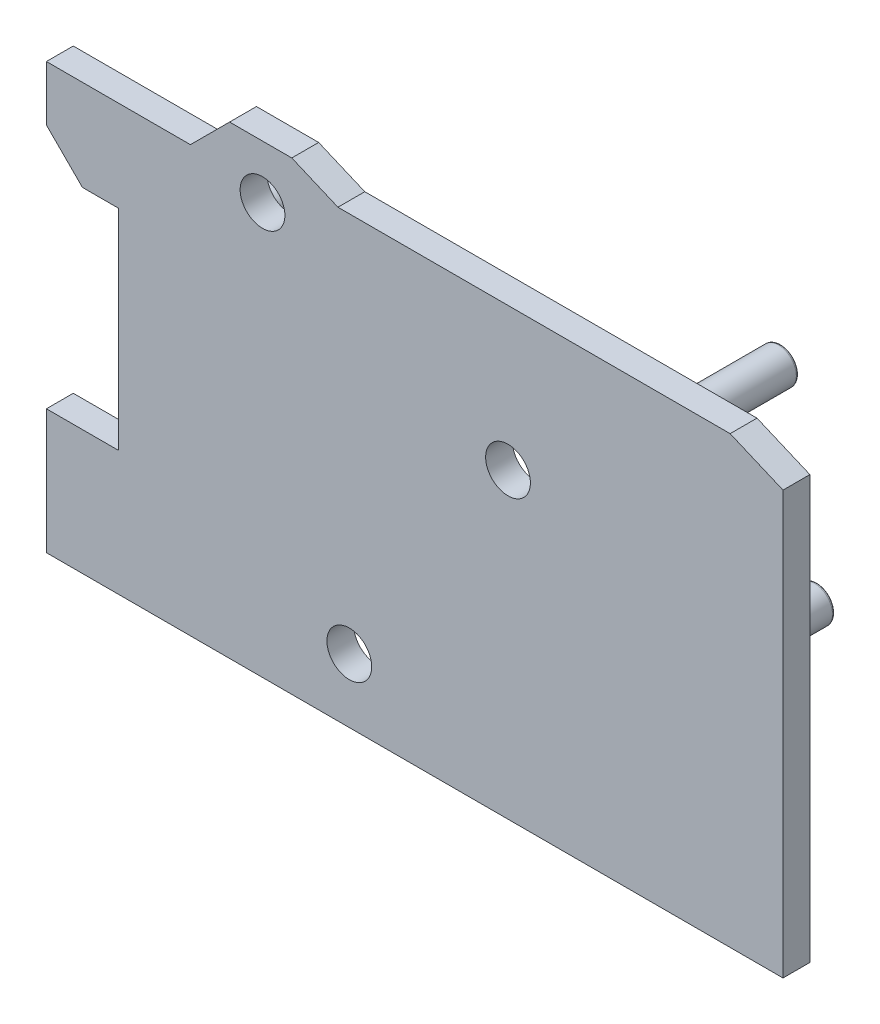
ISO-10303-21;
HEADER;
FILE_DESCRIPTION(('STEP AP214'),'2;1');
FILE_NAME('part.step','',(''),(''),'','','');
FILE_SCHEMA(('AUTOMOTIVE_DESIGN { 1 0 10303 214 1 1 1 1 }'));
ENDSEC;
DATA;
#1=APPLICATION_CONTEXT('core data for automotive mechanical design processes');
#2=APPLICATION_PROTOCOL_DEFINITION('international standard','automotive_design',2000,#1);
#3=PRODUCT_CONTEXT('',#1,'mechanical');
#4=PRODUCT('Part','Part','',(#3));
#5=PRODUCT_RELATED_PRODUCT_CATEGORY('part','',(#4));
#6=PRODUCT_DEFINITION_FORMATION('','',#4);
#7=PRODUCT_DEFINITION_CONTEXT('part definition',#1,'design');
#8=PRODUCT_DEFINITION('design','',#6,#7);
#9=PRODUCT_DEFINITION_SHAPE('','',#8);
#10=(LENGTH_UNIT() NAMED_UNIT(*) SI_UNIT(.MILLI.,.METRE.));
#11=(NAMED_UNIT(*) PLANE_ANGLE_UNIT() SI_UNIT($,.RADIAN.));
#12=(NAMED_UNIT(*) SI_UNIT($,.STERADIAN.) SOLID_ANGLE_UNIT());
#13=UNCERTAINTY_MEASURE_WITH_UNIT(LENGTH_MEASURE(1.E-05),#10,'distance_accuracy_value','');
#14=(GEOMETRIC_REPRESENTATION_CONTEXT(3) GLOBAL_UNCERTAINTY_ASSIGNED_CONTEXT((#13)) GLOBAL_UNIT_ASSIGNED_CONTEXT((#10,
#11,#12)) REPRESENTATION_CONTEXT('',''));
#15=CARTESIAN_POINT('',(0.,0.,0.));
#16=DIRECTION('',(0.,0.,1.));
#17=DIRECTION('',(1.,0.,0.));
#18=AXIS2_PLACEMENT_3D('',#15,#16,#17);
#19=CARTESIAN_POINT('',(0.,0.,0.));
#20=DIRECTION('',(0.,0.,1.));
#21=DIRECTION('',(1.,0.,0.));
#22=AXIS2_PLACEMENT_3D('',#19,#20,#21);
#23=PLANE('',#22);
#24=DIRECTION('',(0.,1.,0.));
#25=VECTOR('',#24,1.);
#26=CARTESIAN_POINT('',(-41.9859879824044,0.,0.));
#27=LINE('',#26,#25);
#28=CARTESIAN_POINT('',(-41.9859879824044,15.3226512655119,0.));
#29=VERTEX_POINT('',#28);
#30=CARTESIAN_POINT('',(-41.9859879824044,21.4676722339106,0.));
#31=VERTEX_POINT('',#30);
#32=EDGE_CURVE('E190',#29,#31,#27,.T.);
#33=ORIENTED_EDGE('',*,*,#32,.T.);
#34=DIRECTION('',(1.,0.,0.));
#35=VECTOR('',#34,1.);
#36=CARTESIAN_POINT('',(0.,21.4676722339106,0.));
#37=LINE('',#36,#35);
#38=CARTESIAN_POINT('',(-25.9008330348861,21.4676722339106,0.));
#39=VERTEX_POINT('',#38);
#40=EDGE_CURVE('E225',#31,#39,#37,.T.);
#41=ORIENTED_EDGE('',*,*,#40,.T.);
#42=DIRECTION('',(0.707106781186546,0.707106781186549,0.));
#43=VECTOR('',#42,1.);
#44=CARTESIAN_POINT('',(-23.6842526343984,23.6842526343983,0.));
#45=LINE('',#44,#43);
#46=CARTESIAN_POINT('',(-21.5253547970426,25.8431504717542,0.));
#47=VERTEX_POINT('',#46);
#48=EDGE_CURVE('E223',#39,#47,#45,.T.);
#49=ORIENTED_EDGE('',*,*,#48,.T.);
#50=DIRECTION('',(1.,0.,0.));
#51=VECTOR('',#50,1.);
#52=CARTESIAN_POINT('',(0.,25.8431504717542,0.));
#53=LINE('',#52,#51);
#54=CARTESIAN_POINT('',(-14.5763985821401,25.8431504717542,0.));
#55=VERTEX_POINT('',#54);
#56=EDGE_CURVE('E156',#47,#55,#53,.T.);
#57=ORIENTED_EDGE('',*,*,#56,.T.);
#58=DIRECTION('',(0.920521197051277,-0.390692623144184,0.));
#59=VECTOR('',#58,1.);
#60=CARTESIAN_POINT('',(7.06930031443443,16.656164980511,0.));
#61=LINE('',#60,#59);
#62=CARTESIAN_POINT('',(-9.42180872482766,23.6554113528324,0.));
#63=VERTEX_POINT('',#62);
#64=EDGE_CURVE('E219',#55,#63,#61,.T.);
#65=ORIENTED_EDGE('',*,*,#64,.T.);
#66=DIRECTION('',(1.,0.,0.));
#67=VECTOR('',#66,1.);
#68=CARTESIAN_POINT('',(0.,23.6554113528324,0.));
#69=LINE('',#68,#67);
#70=CARTESIAN_POINT('',(34.3842382576745,23.6554113528324,0.));
#71=VERTEX_POINT('',#70);
#72=EDGE_CURVE('E216',#63,#71,#69,.T.);
#73=ORIENTED_EDGE('',*,*,#72,.T.);
#74=DIRECTION('',(0.920521197051277,-0.390692623144184,0.));
#75=VECTOR('',#74,1.);
#76=CARTESIAN_POINT('',(13.7558871193649,32.4106085641319,0.));
#77=LINE('',#76,#75);
#78=CARTESIAN_POINT('',(40.2905887707238,21.1486058794287,0.));
#79=VERTEX_POINT('',#78);
#80=EDGE_CURVE('E213',#71,#79,#77,.T.);
#81=ORIENTED_EDGE('',*,*,#80,.T.);
#82=DIRECTION('',(0.,-1.,0.));
#83=VECTOR('',#82,1.);
#84=CARTESIAN_POINT('',(40.2905887707238,0.,0.));
#85=LINE('',#84,#83);
#86=CARTESIAN_POINT('',(40.2905887707238,-26.0480687490275,0.));
#87=VERTEX_POINT('',#86);
#88=EDGE_CURVE('E210',#79,#87,#85,.T.);
#89=ORIENTED_EDGE('',*,*,#88,.T.);
#90=DIRECTION('',(-1.,0.,0.));
#91=VECTOR('',#90,1.);
#92=CARTESIAN_POINT('',(0.,-26.0480687490275,0.));
#93=LINE('',#92,#91);
#94=CARTESIAN_POINT('',(-41.9859879824044,-26.0480687490275,0.));
#95=VERTEX_POINT('',#94);
#96=EDGE_CURVE('E207',#87,#95,#93,.T.);
#97=ORIENTED_EDGE('',*,*,#96,.T.);
#98=DIRECTION('',(0.,1.,0.));
#99=VECTOR('',#98,1.);
#100=CARTESIAN_POINT('',(-41.9859879824044,0.,0.));
#101=LINE('',#100,#99);
#102=CARTESIAN_POINT('',(-41.9859879824044,-12.1233586808849,0.));
#103=VERTEX_POINT('',#102);
#104=EDGE_CURVE('E204',#95,#103,#101,.T.);
#105=ORIENTED_EDGE('',*,*,#104,.T.);
#106=DIRECTION('',(1.,0.,0.));
#107=VECTOR('',#106,1.);
#108=CARTESIAN_POINT('',(0.,-12.1233586808849,0.));
#109=LINE('',#108,#107);
#110=CARTESIAN_POINT('',(-33.9434105086453,-12.1233586808849,0.));
#111=VERTEX_POINT('',#110);
#112=EDGE_CURVE('E201',#103,#111,#109,.T.);
#113=ORIENTED_EDGE('',*,*,#112,.T.);
#114=DIRECTION('',(0.,1.,0.));
#115=VECTOR('',#114,1.);
#116=CARTESIAN_POINT('',(-33.9434105086453,0.,0.));
#117=LINE('',#116,#115);
#118=CARTESIAN_POINT('',(-33.9434105086453,11.3013625286319,0.));
#119=VERTEX_POINT('',#118);
#120=EDGE_CURVE('E198',#111,#119,#117,.T.);
#121=ORIENTED_EDGE('',*,*,#120,.T.);
#122=DIRECTION('',(-1.,0.,0.));
#123=VECTOR('',#122,1.);
#124=CARTESIAN_POINT('',(0.,11.3013625286319,0.));
#125=LINE('',#124,#123);
#126=CARTESIAN_POINT('',(-37.9646992455244,11.3013625286319,0.));
#127=VERTEX_POINT('',#126);
#128=EDGE_CURVE('E195',#119,#127,#125,.T.);
#129=ORIENTED_EDGE('',*,*,#128,.T.);
#130=DIRECTION('',(-0.707106781186549,0.707106781186546,0.));
#131=VECTOR('',#130,1.);
#132=CARTESIAN_POINT('',(-13.3316683584461,-13.3316683584462,0.));
#133=LINE('',#132,#131);
#134=EDGE_CURVE('E192',#127,#29,#133,.T.);
#135=ORIENTED_EDGE('',*,*,#134,.T.);
#136=EDGE_LOOP('',(#33,#41,#49,#57,#65,#73,#81,#89,#97,#105,#113,#121,#129,#135));
#137=FACE_BOUND('',#136,.T.);
#138=CARTESIAN_POINT('',(-17.8476996058403,19.8975408613633,0.));
#139=DIRECTION('',(0.,0.,1.));
#140=DIRECTION('',(1.,0.,0.));
#141=AXIS2_PLACEMENT_3D('',#138,#139,#140);
#142=CIRCLE('',#141,2.5);
#143=CARTESIAN_POINT('',(-15.3476996058403,19.8975408613633,0.));
#144=VERTEX_POINT('',#143);
#145=EDGE_CURVE('E187',#144,#144,#142,.T.);
#146=ORIENTED_EDGE('',*,*,#145,.T.);
#147=EDGE_LOOP('',(#146));
#148=FACE_BOUND('',#147,.T.);
#149=CARTESIAN_POINT('',(-8.15375873902702,-18.910029411339,0.));
#150=DIRECTION('',(0.,0.,1.));
#151=DIRECTION('',(1.,0.,0.));
#152=AXIS2_PLACEMENT_3D('',#149,#150,#151);
#153=CIRCLE('',#152,2.5);
#154=CARTESIAN_POINT('',(-5.65375873902702,-18.910029411339,0.));
#155=VERTEX_POINT('',#154);
#156=EDGE_CURVE('E183',#155,#155,#153,.T.);
#157=ORIENTED_EDGE('',*,*,#156,.T.);
#158=EDGE_LOOP('',(#157));
#159=FACE_BOUND('',#158,.T.);
#160=CARTESIAN_POINT('',(9.57424648476948,7.73050044046848,0.));
#161=DIRECTION('',(0.,0.,1.));
#162=DIRECTION('',(1.,0.,0.));
#163=AXIS2_PLACEMENT_3D('',#160,#161,#162);
#164=CIRCLE('',#163,2.5);
#165=CARTESIAN_POINT('',(12.0742464847695,7.73050044046848,0.));
#166=VERTEX_POINT('',#165);
#167=EDGE_CURVE('E180',#166,#166,#164,.T.);
#168=ORIENTED_EDGE('',*,*,#167,.T.);
#169=EDGE_LOOP('',(#168));
#170=FACE_BOUND('',#169,.T.);
#171=CARTESIAN_POINT('',(-29.1621071764082,7.87426998428596,0.));
#172=DIRECTION('',(0.,0.,1.));
#173=DIRECTION('',(1.,0.,0.));
#174=AXIS2_PLACEMENT_3D('',#171,#172,#173);
#175=CIRCLE('',#174,4.);
#176=CARTESIAN_POINT('',(-25.1621071764082,7.87426998428596,0.));
#177=VERTEX_POINT('',#176);
#178=EDGE_CURVE('E431',#177,#177,#175,.T.);
#179=ORIENTED_EDGE('',*,*,#178,.T.);
#180=EDGE_LOOP('',(#179));
#181=FACE_BOUND('',#180,.T.);
#182=CARTESIAN_POINT('',(24.5742464847695,17.7305004404685,0.));
#183=DIRECTION('',(0.,0.,1.));
#184=DIRECTION('',(1.,0.,0.));
#185=AXIS2_PLACEMENT_3D('',#182,#183,#184);
#186=CIRCLE('',#185,4.);
#187=CARTESIAN_POINT('',(28.5742464847695,17.7305004404685,0.));
#188=VERTEX_POINT('',#187);
#189=EDGE_CURVE('E415',#188,#188,#186,.T.);
#190=ORIENTED_EDGE('',*,*,#189,.T.);
#191=EDGE_LOOP('',(#190));
#192=FACE_BOUND('',#191,.T.);
#193=CARTESIAN_POINT('',(24.6957025991606,-5.26949955953152,0.));
#194=DIRECTION('',(0.,0.,1.));
#195=DIRECTION('',(1.,0.,0.));
#196=AXIS2_PLACEMENT_3D('',#193,#194,#195);
#197=CIRCLE('',#196,0.999999999999999);
#198=CARTESIAN_POINT('',(24.6957025991606,-6.26949955953152,0.));
#199=VERTEX_POINT('',#198);
#200=CARTESIAN_POINT('',(23.7061055991435,-5.12563233756213,0.));
#201=VERTEX_POINT('',#200);
#202=EDGE_CURVE('E370',#199,#201,#197,.F.);
#203=ORIENTED_EDGE('',*,*,#202,.F.);
#204=DIRECTION('',(1.,0.,0.));
#205=VECTOR('',#204,1.);
#206=CARTESIAN_POINT('',(0.,-6.26949955953152,0.));
#207=LINE('',#206,#205);
#208=CARTESIAN_POINT('',(30.5742464847695,-6.26949955953152,0.));
#209=VERTEX_POINT('',#208);
#210=EDGE_CURVE('E374',#199,#209,#207,.T.);
#211=ORIENTED_EDGE('',*,*,#210,.T.);
#212=CARTESIAN_POINT('',(30.5742464847695,-5.26949955953152,0.));
#213=DIRECTION('',(0.,0.,1.));
#214=DIRECTION('',(1.,0.,0.));
#215=AXIS2_PLACEMENT_3D('',#212,#213,#214);
#216=CIRCLE('',#215,1.);
#217=CARTESIAN_POINT('',(31.5742464847695,-5.26949955953152,0.));
#218=VERTEX_POINT('',#217);
#219=EDGE_CURVE('E50',#209,#218,#216,.T.);
#220=ORIENTED_EDGE('',*,*,#219,.T.);
#221=DIRECTION('',(0.,1.,0.));
#222=VECTOR('',#221,1.);
#223=CARTESIAN_POINT('',(31.5742464847695,0.,0.));
#224=LINE('',#223,#222);
#225=CARTESIAN_POINT('',(31.5742464847695,0.609044326077383,0.));
#226=VERTEX_POINT('',#225);
#227=EDGE_CURVE('E404',#218,#226,#224,.T.);
#228=ORIENTED_EDGE('',*,*,#227,.T.);
#229=CARTESIAN_POINT('',(30.5742464847695,0.609044326077383,0.));
#230=DIRECTION('',(0.,0.,1.));
#231=DIRECTION('',(1.,0.,0.));
#232=AXIS2_PLACEMENT_3D('',#229,#230,#231);
#233=CIRCLE('',#232,1.);
#234=CARTESIAN_POINT('',(30.4303792628001,1.59864132609446,0.));
#235=VERTEX_POINT('',#234);
#236=EDGE_CURVE('E407',#226,#235,#233,.T.);
#237=ORIENTED_EDGE('',*,*,#236,.T.);
#238=CARTESIAN_POINT('',(31.5742464847695,-6.26949955953152,0.));
#239=DIRECTION('',(0.,0.,1.));
#240=DIRECTION('',(1.,0.,0.));
#241=AXIS2_PLACEMENT_3D('',#238,#239,#240);
#242=CIRCLE('',#241,7.9508536156538);
#243=EDGE_CURVE('E385',#235,#201,#242,.T.);
#244=ORIENTED_EDGE('',*,*,#243,.T.);
#245=EDGE_LOOP('',(#203,#211,#220,#228,#237,#244));
#246=FACE_BOUND('',#245,.T.);
#247=ADVANCED_FACE('F35',(#137,#148,#159,#170,#181,#192,#246),#23,.F.);
#248=CARTESIAN_POINT('',(-41.9859879824044,0.,3.));
#249=DIRECTION('',(-1.,0.,0.));
#250=DIRECTION('',(0.,0.,1.));
#251=AXIS2_PLACEMENT_3D('',#248,#249,#250);
#252=PLANE('',#251);
#253=ORIENTED_EDGE('',*,*,#32,.F.);
#254=DIRECTION('',(0.,0.,-1.));
#255=VECTOR('',#254,1.);
#256=CARTESIAN_POINT('',(-41.9859879824044,15.3226512655119,3.));
#257=LINE('',#256,#255);
#258=CARTESIAN_POINT('',(-41.9859879824044,15.3226512655119,3.));
#259=VERTEX_POINT('',#258);
#260=EDGE_CURVE('E113',#259,#29,#257,.T.);
#261=ORIENTED_EDGE('',*,*,#260,.F.);
#262=DIRECTION('',(0.,1.,0.));
#263=VECTOR('',#262,1.);
#264=CARTESIAN_POINT('',(-41.9859879824044,0.,3.));
#265=LINE('',#264,#263);
#266=CARTESIAN_POINT('',(-41.9859879824044,21.4676722339106,3.));
#267=VERTEX_POINT('',#266);
#268=EDGE_CURVE('E446',#259,#267,#265,.T.);
#269=ORIENTED_EDGE('',*,*,#268,.T.);
#270=DIRECTION('',(0.,0.,-1.));
#271=VECTOR('',#270,1.);
#272=CARTESIAN_POINT('',(-41.9859879824044,21.4676722339106,3.));
#273=LINE('',#272,#271);
#274=EDGE_CURVE('E59',#267,#31,#273,.T.);
#275=ORIENTED_EDGE('',*,*,#274,.T.);
#276=EDGE_LOOP('',(#253,#261,#269,#275));
#277=FACE_BOUND('',#276,.T.);
#278=ADVANCED_FACE('F278',(#277),#252,.T.);
#279=CARTESIAN_POINT('',(-13.3316683584461,-13.3316683584462,3.));
#280=DIRECTION('',(-0.707106781186546,-0.707106781186549,0.));
#281=DIRECTION('',(0.707106781186549,-0.707106781186546,0.));
#282=AXIS2_PLACEMENT_3D('',#279,#280,#281);
#283=PLANE('',#282);
#284=ORIENTED_EDGE('',*,*,#134,.F.);
#285=DIRECTION('',(0.,0.,-1.));
#286=VECTOR('',#285,1.);
#287=CARTESIAN_POINT('',(-37.9646992455244,11.3013625286319,3.));
#288=LINE('',#287,#286);
#289=CARTESIAN_POINT('',(-37.9646992455244,11.3013625286319,3.));
#290=VERTEX_POINT('',#289);
#291=EDGE_CURVE('E248',#290,#127,#288,.T.);
#292=ORIENTED_EDGE('',*,*,#291,.F.);
#293=DIRECTION('',(-0.707106781186549,0.707106781186546,0.));
#294=VECTOR('',#293,1.);
#295=CARTESIAN_POINT('',(-13.3316683584461,-13.3316683584462,3.));
#296=LINE('',#295,#294);
#297=EDGE_CURVE('E448',#290,#259,#296,.T.);
#298=ORIENTED_EDGE('',*,*,#297,.T.);
#299=ORIENTED_EDGE('',*,*,#260,.T.);
#300=EDGE_LOOP('',(#284,#292,#298,#299));
#301=FACE_BOUND('',#300,.T.);
#302=ADVANCED_FACE('F284',(#301),#283,.T.);
#303=CARTESIAN_POINT('',(0.,11.3013625286319,3.));
#304=DIRECTION('',(0.,-1.,0.));
#305=DIRECTION('',(1.,0.,0.));
#306=AXIS2_PLACEMENT_3D('',#303,#304,#305);
#307=PLANE('',#306);
#308=ORIENTED_EDGE('',*,*,#128,.F.);
#309=DIRECTION('',(0.,0.,-1.));
#310=VECTOR('',#309,1.);
#311=CARTESIAN_POINT('',(-33.9434105086453,11.3013625286319,3.));
#312=LINE('',#311,#310);
#313=CARTESIAN_POINT('',(-33.9434105086453,11.3013625286319,3.));
#314=VERTEX_POINT('',#313);
#315=EDGE_CURVE('E246',#314,#119,#312,.T.);
#316=ORIENTED_EDGE('',*,*,#315,.F.);
#317=DIRECTION('',(-1.,0.,0.));
#318=VECTOR('',#317,1.);
#319=CARTESIAN_POINT('',(0.,11.3013625286319,3.));
#320=LINE('',#319,#318);
#321=EDGE_CURVE('E451',#314,#290,#320,.T.);
#322=ORIENTED_EDGE('',*,*,#321,.T.);
#323=ORIENTED_EDGE('',*,*,#291,.T.);
#324=EDGE_LOOP('',(#308,#316,#322,#323));
#325=FACE_BOUND('',#324,.T.);
#326=ADVANCED_FACE('F330',(#325),#307,.T.);
#327=CARTESIAN_POINT('',(-33.9434105086453,0.,3.));
#328=DIRECTION('',(-1.,0.,0.));
#329=DIRECTION('',(0.,0.,1.));
#330=AXIS2_PLACEMENT_3D('',#327,#328,#329);
#331=PLANE('',#330);
#332=ORIENTED_EDGE('',*,*,#120,.F.);
#333=DIRECTION('',(0.,0.,-1.));
#334=VECTOR('',#333,1.);
#335=CARTESIAN_POINT('',(-33.9434105086453,-12.1233586808849,3.));
#336=LINE('',#335,#334);
#337=CARTESIAN_POINT('',(-33.9434105086453,-12.1233586808849,3.));
#338=VERTEX_POINT('',#337);
#339=EDGE_CURVE('E244',#338,#111,#336,.T.);
#340=ORIENTED_EDGE('',*,*,#339,.F.);
#341=DIRECTION('',(0.,1.,0.));
#342=VECTOR('',#341,1.);
#343=CARTESIAN_POINT('',(-33.9434105086453,0.,3.));
#344=LINE('',#343,#342);
#345=EDGE_CURVE('E454',#338,#314,#344,.T.);
#346=ORIENTED_EDGE('',*,*,#345,.T.);
#347=ORIENTED_EDGE('',*,*,#315,.T.);
#348=EDGE_LOOP('',(#332,#340,#346,#347));
#349=FACE_BOUND('',#348,.T.);
#350=ADVANCED_FACE('F326',(#349),#331,.T.);
#351=CARTESIAN_POINT('',(0.,-12.1233586808849,3.));
#352=DIRECTION('',(0.,1.,0.));
#353=DIRECTION('',(0.,0.,1.));
#354=AXIS2_PLACEMENT_3D('',#351,#352,#353);
#355=PLANE('',#354);
#356=ORIENTED_EDGE('',*,*,#112,.F.);
#357=DIRECTION('',(0.,0.,-1.));
#358=VECTOR('',#357,1.);
#359=CARTESIAN_POINT('',(-41.9859879824044,-12.1233586808849,3.));
#360=LINE('',#359,#358);
#361=CARTESIAN_POINT('',(-41.9859879824044,-12.1233586808849,3.));
#362=VERTEX_POINT('',#361);
#363=EDGE_CURVE('E242',#362,#103,#360,.T.);
#364=ORIENTED_EDGE('',*,*,#363,.F.);
#365=DIRECTION('',(1.,0.,0.));
#366=VECTOR('',#365,1.);
#367=CARTESIAN_POINT('',(0.,-12.1233586808849,3.));
#368=LINE('',#367,#366);
#369=EDGE_CURVE('E457',#362,#338,#368,.T.);
#370=ORIENTED_EDGE('',*,*,#369,.T.);
#371=ORIENTED_EDGE('',*,*,#339,.T.);
#372=EDGE_LOOP('',(#356,#364,#370,#371));
#373=FACE_BOUND('',#372,.T.);
#374=ADVANCED_FACE('F322',(#373),#355,.T.);
#375=CARTESIAN_POINT('',(-41.9859879824044,0.,3.));
#376=DIRECTION('',(-1.,0.,0.));
#377=DIRECTION('',(0.,0.,1.));
#378=AXIS2_PLACEMENT_3D('',#375,#376,#377);
#379=PLANE('',#378);
#380=ORIENTED_EDGE('',*,*,#104,.F.);
#381=DIRECTION('',(0.,0.,-1.));
#382=VECTOR('',#381,1.);
#383=CARTESIAN_POINT('',(-41.9859879824044,-26.0480687490275,3.));
#384=LINE('',#383,#382);
#385=CARTESIAN_POINT('',(-41.9859879824044,-26.0480687490275,3.));
#386=VERTEX_POINT('',#385);
#387=EDGE_CURVE('E240',#386,#95,#384,.T.);
#388=ORIENTED_EDGE('',*,*,#387,.F.);
#389=DIRECTION('',(0.,1.,0.));
#390=VECTOR('',#389,1.);
#391=CARTESIAN_POINT('',(-41.9859879824044,0.,3.));
#392=LINE('',#391,#390);
#393=EDGE_CURVE('E460',#386,#362,#392,.T.);
#394=ORIENTED_EDGE('',*,*,#393,.T.);
#395=ORIENTED_EDGE('',*,*,#363,.T.);
#396=EDGE_LOOP('',(#380,#388,#394,#395));
#397=FACE_BOUND('',#396,.T.);
#398=ADVANCED_FACE('F318',(#397),#379,.T.);
#399=CARTESIAN_POINT('',(0.,-26.0480687490275,3.));
#400=DIRECTION('',(0.,-1.,0.));
#401=DIRECTION('',(1.,0.,0.));
#402=AXIS2_PLACEMENT_3D('',#399,#400,#401);
#403=PLANE('',#402);
#404=ORIENTED_EDGE('',*,*,#96,.F.);
#405=DIRECTION('',(0.,0.,-1.));
#406=VECTOR('',#405,1.);
#407=CARTESIAN_POINT('',(40.2905887707238,-26.0480687490275,3.));
#408=LINE('',#407,#406);
#409=CARTESIAN_POINT('',(40.2905887707238,-26.0480687490275,3.));
#410=VERTEX_POINT('',#409);
#411=EDGE_CURVE('E238',#410,#87,#408,.T.);
#412=ORIENTED_EDGE('',*,*,#411,.F.);
#413=DIRECTION('',(-1.,0.,0.));
#414=VECTOR('',#413,1.);
#415=CARTESIAN_POINT('',(0.,-26.0480687490275,3.));
#416=LINE('',#415,#414);
#417=EDGE_CURVE('E463',#410,#386,#416,.T.);
#418=ORIENTED_EDGE('',*,*,#417,.T.);
#419=ORIENTED_EDGE('',*,*,#387,.T.);
#420=EDGE_LOOP('',(#404,#412,#418,#419));
#421=FACE_BOUND('',#420,.T.);
#422=ADVANCED_FACE('F314',(#421),#403,.T.);
#423=CARTESIAN_POINT('',(40.2905887707238,0.,3.));
#424=DIRECTION('',(1.,0.,0.));
#425=DIRECTION('',(0.,1.,0.));
#426=AXIS2_PLACEMENT_3D('',#423,#424,#425);
#427=PLANE('',#426);
#428=ORIENTED_EDGE('',*,*,#88,.F.);
#429=DIRECTION('',(0.,0.,-1.));
#430=VECTOR('',#429,1.);
#431=CARTESIAN_POINT('',(40.2905887707238,21.1486058794287,3.));
#432=LINE('',#431,#430);
#433=CARTESIAN_POINT('',(40.2905887707238,21.1486058794287,3.));
#434=VERTEX_POINT('',#433);
#435=EDGE_CURVE('E236',#434,#79,#432,.T.);
#436=ORIENTED_EDGE('',*,*,#435,.F.);
#437=DIRECTION('',(0.,-1.,0.));
#438=VECTOR('',#437,1.);
#439=CARTESIAN_POINT('',(40.2905887707238,0.,3.));
#440=LINE('',#439,#438);
#441=EDGE_CURVE('E466',#434,#410,#440,.T.);
#442=ORIENTED_EDGE('',*,*,#441,.T.);
#443=ORIENTED_EDGE('',*,*,#411,.T.);
#444=EDGE_LOOP('',(#428,#436,#442,#443));
#445=FACE_BOUND('',#444,.T.);
#446=ADVANCED_FACE('F310',(#445),#427,.T.);
#447=CARTESIAN_POINT('',(13.7558871193649,32.4106085641319,3.));
#448=DIRECTION('',(0.390692623144184,0.920521197051277,0.));
#449=DIRECTION('',(-0.920521197051277,0.390692623144184,0.));
#450=AXIS2_PLACEMENT_3D('',#447,#448,#449);
#451=PLANE('',#450);
#452=ORIENTED_EDGE('',*,*,#80,.F.);
#453=DIRECTION('',(0.,0.,-1.));
#454=VECTOR('',#453,1.);
#455=CARTESIAN_POINT('',(34.3842382576745,23.6554113528324,3.));
#456=LINE('',#455,#454);
#457=CARTESIAN_POINT('',(34.3842382576745,23.6554113528324,3.));
#458=VERTEX_POINT('',#457);
#459=EDGE_CURVE('E234',#458,#71,#456,.T.);
#460=ORIENTED_EDGE('',*,*,#459,.F.);
#461=DIRECTION('',(0.920521197051277,-0.390692623144184,0.));
#462=VECTOR('',#461,1.);
#463=CARTESIAN_POINT('',(13.7558871193649,32.4106085641319,3.));
#464=LINE('',#463,#462);
#465=EDGE_CURVE('E469',#458,#434,#464,.T.);
#466=ORIENTED_EDGE('',*,*,#465,.T.);
#467=ORIENTED_EDGE('',*,*,#435,.T.);
#468=EDGE_LOOP('',(#452,#460,#466,#467));
#469=FACE_BOUND('',#468,.T.);
#470=ADVANCED_FACE('F306',(#469),#451,.T.);
#471=CARTESIAN_POINT('',(0.,23.6554113528324,3.));
#472=DIRECTION('',(0.,1.,0.));
#473=DIRECTION('',(-1.,0.,0.));
#474=AXIS2_PLACEMENT_3D('',#471,#472,#473);
#475=PLANE('',#474);
#476=ORIENTED_EDGE('',*,*,#72,.F.);
#477=DIRECTION('',(0.,0.,-1.));
#478=VECTOR('',#477,1.);
#479=CARTESIAN_POINT('',(-9.42180872482766,23.6554113528324,3.));
#480=LINE('',#479,#478);
#481=CARTESIAN_POINT('',(-9.42180872482766,23.6554113528324,3.));
#482=VERTEX_POINT('',#481);
#483=EDGE_CURVE('E232',#482,#63,#480,.T.);
#484=ORIENTED_EDGE('',*,*,#483,.F.);
#485=DIRECTION('',(1.,0.,0.));
#486=VECTOR('',#485,1.);
#487=CARTESIAN_POINT('',(0.,23.6554113528324,3.));
#488=LINE('',#487,#486);
#489=EDGE_CURVE('E472',#482,#458,#488,.T.);
#490=ORIENTED_EDGE('',*,*,#489,.T.);
#491=ORIENTED_EDGE('',*,*,#459,.T.);
#492=EDGE_LOOP('',(#476,#484,#490,#491));
#493=FACE_BOUND('',#492,.T.);
#494=ADVANCED_FACE('F302',(#493),#475,.T.);
#495=CARTESIAN_POINT('',(7.06930031443443,16.656164980511,3.));
#496=DIRECTION('',(0.390692623144184,0.920521197051277,0.));
#497=DIRECTION('',(-0.920521197051277,0.390692623144184,0.));
#498=AXIS2_PLACEMENT_3D('',#495,#496,#497);
#499=PLANE('',#498);
#500=ORIENTED_EDGE('',*,*,#64,.F.);
#501=DIRECTION('',(0.,0.,-1.));
#502=VECTOR('',#501,1.);
#503=CARTESIAN_POINT('',(-14.5763985821401,25.8431504717542,3.));
#504=LINE('',#503,#502);
#505=CARTESIAN_POINT('',(-14.5763985821401,25.8431504717542,3.));
#506=VERTEX_POINT('',#505);
#507=EDGE_CURVE('E161',#506,#55,#504,.T.);
#508=ORIENTED_EDGE('',*,*,#507,.F.);
#509=DIRECTION('',(0.920521197051277,-0.390692623144184,0.));
#510=VECTOR('',#509,1.);
#511=CARTESIAN_POINT('',(7.06930031443443,16.656164980511,3.));
#512=LINE('',#511,#510);
#513=EDGE_CURVE('E172',#506,#482,#512,.T.);
#514=ORIENTED_EDGE('',*,*,#513,.T.);
#515=ORIENTED_EDGE('',*,*,#483,.T.);
#516=EDGE_LOOP('',(#500,#508,#514,#515));
#517=FACE_BOUND('',#516,.T.);
#518=ADVANCED_FACE('F299',(#517),#499,.T.);
#519=CARTESIAN_POINT('',(0.,25.8431504717542,3.));
#520=DIRECTION('',(0.,1.,0.));
#521=DIRECTION('',(0.,0.,1.));
#522=AXIS2_PLACEMENT_3D('',#519,#520,#521);
#523=PLANE('',#522);
#524=ORIENTED_EDGE('',*,*,#56,.F.);
#525=DIRECTION('',(0.,0.,-1.));
#526=VECTOR('',#525,1.);
#527=CARTESIAN_POINT('',(-21.5253547970426,25.8431504717542,3.));
#528=LINE('',#527,#526);
#529=CARTESIAN_POINT('',(-21.5253547970426,25.8431504717542,3.));
#530=VERTEX_POINT('',#529);
#531=EDGE_CURVE('E151',#530,#47,#528,.T.);
#532=ORIENTED_EDGE('',*,*,#531,.F.);
#533=DIRECTION('',(1.,0.,0.));
#534=VECTOR('',#533,1.);
#535=CARTESIAN_POINT('',(0.,25.8431504717542,3.));
#536=LINE('',#535,#534);
#537=EDGE_CURVE('E154',#530,#506,#536,.T.);
#538=ORIENTED_EDGE('',*,*,#537,.T.);
#539=ORIENTED_EDGE('',*,*,#507,.T.);
#540=EDGE_LOOP('',(#524,#532,#538,#539));
#541=FACE_BOUND('',#540,.T.);
#542=ADVANCED_FACE('F153',(#541),#523,.T.);
#543=CARTESIAN_POINT('',(-23.6842526343984,23.6842526343983,3.));
#544=DIRECTION('',(-0.707106781186549,0.707106781186546,0.));
#545=DIRECTION('',(-0.707106781186546,-0.707106781186549,0.));
#546=AXIS2_PLACEMENT_3D('',#543,#544,#545);
#547=PLANE('',#546);
#548=ORIENTED_EDGE('',*,*,#48,.F.);
#549=DIRECTION('',(0.,0.,-1.));
#550=VECTOR('',#549,1.);
#551=CARTESIAN_POINT('',(-25.9008330348861,21.4676722339106,3.));
#552=LINE('',#551,#550);
#553=CARTESIAN_POINT('',(-25.9008330348861,21.4676722339106,3.));
#554=VERTEX_POINT('',#553);
#555=EDGE_CURVE('E162',#554,#39,#552,.T.);
#556=ORIENTED_EDGE('',*,*,#555,.F.);
#557=DIRECTION('',(0.707106781186546,0.707106781186549,0.));
#558=VECTOR('',#557,1.);
#559=CARTESIAN_POINT('',(-23.6842526343984,23.6842526343983,3.));
#560=LINE('',#559,#558);
#561=EDGE_CURVE('E169',#554,#530,#560,.T.);
#562=ORIENTED_EDGE('',*,*,#561,.T.);
#563=ORIENTED_EDGE('',*,*,#531,.T.);
#564=EDGE_LOOP('',(#548,#556,#562,#563));
#565=FACE_BOUND('',#564,.T.);
#566=ADVANCED_FACE('F174',(#565),#547,.T.);
#567=CARTESIAN_POINT('',(-17.8476996058403,19.8975408613633,3.));
#568=DIRECTION('',(0.,0.,-1.));
#569=DIRECTION('',(-1.,0.,0.));
#570=AXIS2_PLACEMENT_3D('',#567,#568,#569);
#571=CYLINDRICAL_SURFACE('',#570,2.5);
#572=CARTESIAN_POINT('',(-17.8476996058403,19.8975408613633,3.));
#573=DIRECTION('',(0.,0.,1.));
#574=DIRECTION('',(1.,0.,0.));
#575=AXIS2_PLACEMENT_3D('',#572,#573,#574);
#576=CIRCLE('',#575,2.5);
#577=CARTESIAN_POINT('',(-15.3476996058403,19.8975408613633,3.));
#578=VERTEX_POINT('',#577);
#579=EDGE_CURVE('E443',#578,#578,#576,.T.);
#580=ORIENTED_EDGE('',*,*,#579,.T.);
#581=EDGE_LOOP('',(#580));
#582=FACE_BOUND('',#581,.T.);
#583=ORIENTED_EDGE('',*,*,#145,.F.);
#584=EDGE_LOOP('',(#583));
#585=FACE_BOUND('',#584,.T.);
#586=ADVANCED_FACE('F296',(#582,#585),#571,.F.);
#587=CARTESIAN_POINT('',(-8.15375873902702,-18.910029411339,3.));
#588=DIRECTION('',(0.,0.,-1.));
#589=DIRECTION('',(-1.,0.,0.));
#590=AXIS2_PLACEMENT_3D('',#587,#588,#589);
#591=CYLINDRICAL_SURFACE('',#590,2.5);
#592=CARTESIAN_POINT('',(-8.15375873902702,-18.910029411339,3.));
#593=DIRECTION('',(0.,0.,1.));
#594=DIRECTION('',(1.,0.,0.));
#595=AXIS2_PLACEMENT_3D('',#592,#593,#594);
#596=CIRCLE('',#595,2.5);
#597=CARTESIAN_POINT('',(-5.65375873902702,-18.910029411339,3.));
#598=VERTEX_POINT('',#597);
#599=EDGE_CURVE('E440',#598,#598,#596,.T.);
#600=ORIENTED_EDGE('',*,*,#599,.T.);
#601=EDGE_LOOP('',(#600));
#602=FACE_BOUND('',#601,.T.);
#603=ORIENTED_EDGE('',*,*,#156,.F.);
#604=EDGE_LOOP('',(#603));
#605=FACE_BOUND('',#604,.T.);
#606=ADVANCED_FACE('F340',(#602,#605),#591,.F.);
#607=CARTESIAN_POINT('',(9.57424648476948,7.73050044046848,3.));
#608=DIRECTION('',(0.,0.,-1.));
#609=DIRECTION('',(-1.,0.,0.));
#610=AXIS2_PLACEMENT_3D('',#607,#608,#609);
#611=CYLINDRICAL_SURFACE('',#610,2.5);
#612=CARTESIAN_POINT('',(9.57424648476948,7.73050044046848,3.));
#613=DIRECTION('',(0.,0.,1.));
#614=DIRECTION('',(1.,0.,0.));
#615=AXIS2_PLACEMENT_3D('',#612,#613,#614);
#616=CIRCLE('',#615,2.5);
#617=CARTESIAN_POINT('',(12.0742464847695,7.73050044046848,3.));
#618=VERTEX_POINT('',#617);
#619=EDGE_CURVE('E228',#618,#618,#616,.T.);
#620=ORIENTED_EDGE('',*,*,#619,.T.);
#621=EDGE_LOOP('',(#620));
#622=FACE_BOUND('',#621,.T.);
#623=ORIENTED_EDGE('',*,*,#167,.F.);
#624=EDGE_LOOP('',(#623));
#625=FACE_BOUND('',#624,.T.);
#626=ADVANCED_FACE('F293',(#622,#625),#611,.F.);
#627=CARTESIAN_POINT('',(0.,21.4676722339106,3.));
#628=DIRECTION('',(0.,1.,0.));
#629=DIRECTION('',(0.,0.,1.));
#630=AXIS2_PLACEMENT_3D('',#627,#628,#629);
#631=PLANE('',#630);
#632=ORIENTED_EDGE('',*,*,#40,.F.);
#633=ORIENTED_EDGE('',*,*,#274,.F.);
#634=DIRECTION('',(1.,0.,0.));
#635=VECTOR('',#634,1.);
#636=CARTESIAN_POINT('',(0.,21.4676722339106,3.));
#637=LINE('',#636,#635);
#638=EDGE_CURVE('E175',#267,#554,#637,.T.);
#639=ORIENTED_EDGE('',*,*,#638,.T.);
#640=ORIENTED_EDGE('',*,*,#555,.T.);
#641=EDGE_LOOP('',(#632,#633,#639,#640));
#642=FACE_BOUND('',#641,.T.);
#643=ADVANCED_FACE('F290',(#642),#631,.T.);
#644=CARTESIAN_POINT('',(0.,0.,3.));
#645=DIRECTION('',(0.,0.,1.));
#646=DIRECTION('',(1.,0.,0.));
#647=AXIS2_PLACEMENT_3D('',#644,#645,#646);
#648=PLANE('',#647);
#649=ORIENTED_EDGE('',*,*,#619,.F.);
#650=EDGE_LOOP('',(#649));
#651=FACE_BOUND('',#650,.T.);
#652=ORIENTED_EDGE('',*,*,#599,.F.);
#653=EDGE_LOOP('',(#652));
#654=FACE_BOUND('',#653,.T.);
#655=ORIENTED_EDGE('',*,*,#579,.F.);
#656=EDGE_LOOP('',(#655));
#657=FACE_BOUND('',#656,.T.);
#658=ORIENTED_EDGE('',*,*,#268,.F.);
#659=ORIENTED_EDGE('',*,*,#297,.F.);
#660=ORIENTED_EDGE('',*,*,#321,.F.);
#661=ORIENTED_EDGE('',*,*,#345,.F.);
#662=ORIENTED_EDGE('',*,*,#369,.F.);
#663=ORIENTED_EDGE('',*,*,#393,.F.);
#664=ORIENTED_EDGE('',*,*,#417,.F.);
#665=ORIENTED_EDGE('',*,*,#441,.F.);
#666=ORIENTED_EDGE('',*,*,#465,.F.);
#667=ORIENTED_EDGE('',*,*,#489,.F.);
#668=ORIENTED_EDGE('',*,*,#513,.F.);
#669=ORIENTED_EDGE('',*,*,#537,.F.);
#670=ORIENTED_EDGE('',*,*,#561,.F.);
#671=ORIENTED_EDGE('',*,*,#638,.F.);
#672=EDGE_LOOP('',(#658,#659,#660,#661,#662,#663,#664,#665,#666,#667,#668,#669,#670,#671));
#673=FACE_BOUND('',#672,.T.);
#674=ADVANCED_FACE('F167',(#651,#654,#657,#673),#648,.T.);
#675=CARTESIAN_POINT('',(-29.1621071764082,7.87426998428596,-0.5));
#676=DIRECTION('',(0.,0.,1.));
#677=DIRECTION('',(1.,0.,0.));
#678=AXIS2_PLACEMENT_3D('',#675,#676,#677);
#679=CYLINDRICAL_SURFACE('',#678,4.);
#680=CARTESIAN_POINT('',(-29.1621071764082,7.87426998428596,-0.5));
#681=DIRECTION('',(0.,0.,1.));
#682=DIRECTION('',(1.,0.,0.));
#683=AXIS2_PLACEMENT_3D('',#680,#681,#682);
#684=CIRCLE('',#683,4.);
#685=CARTESIAN_POINT('',(-25.1621071764082,7.87426998428596,-0.5));
#686=VERTEX_POINT('',#685);
#687=EDGE_CURVE('E184',#686,#686,#684,.T.);
#688=ORIENTED_EDGE('',*,*,#687,.T.);
#689=EDGE_LOOP('',(#688));
#690=FACE_BOUND('',#689,.T.);
#691=ORIENTED_EDGE('',*,*,#178,.F.);
#692=EDGE_LOOP('',(#691));
#693=FACE_BOUND('',#692,.T.);
#694=ADVANCED_FACE('F496',(#690,#693),#679,.T.);
#695=CARTESIAN_POINT('',(0.,0.,-0.5));
#696=DIRECTION('',(0.,0.,1.));
#697=DIRECTION('',(1.,0.,0.));
#698=AXIS2_PLACEMENT_3D('',#695,#696,#697);
#699=PLANE('',#698);
#700=CARTESIAN_POINT('',(-29.1621071764082,7.87426998428596,-0.5));
#701=DIRECTION('',(0.,0.,1.));
#702=DIRECTION('',(1.,0.,0.));
#703=AXIS2_PLACEMENT_3D('',#700,#701,#702);
#704=CIRCLE('',#703,2.);
#705=CARTESIAN_POINT('',(-27.1621071764082,7.87426998428596,-0.5));
#706=VERTEX_POINT('',#705);
#707=EDGE_CURVE('E377',#706,#706,#704,.T.);
#708=ORIENTED_EDGE('',*,*,#707,.T.);
#709=EDGE_LOOP('',(#708));
#710=FACE_BOUND('',#709,.T.);
#711=ORIENTED_EDGE('',*,*,#687,.F.);
#712=EDGE_LOOP('',(#711));
#713=FACE_BOUND('',#712,.T.);
#714=ADVANCED_FACE('F501',(#710,#713),#699,.F.);
#715=CARTESIAN_POINT('',(24.5742464847695,17.7305004404685,-0.5));
#716=DIRECTION('',(0.,0.,1.));
#717=DIRECTION('',(1.,0.,0.));
#718=AXIS2_PLACEMENT_3D('',#715,#716,#717);
#719=CYLINDRICAL_SURFACE('',#718,4.);
#720=CARTESIAN_POINT('',(24.5742464847695,17.7305004404685,-0.5));
#721=DIRECTION('',(0.,0.,1.));
#722=DIRECTION('',(1.,0.,0.));
#723=AXIS2_PLACEMENT_3D('',#720,#721,#722);
#724=CIRCLE('',#723,4.);
#725=CARTESIAN_POINT('',(28.5742464847695,17.7305004404685,-0.5));
#726=VERTEX_POINT('',#725);
#727=EDGE_CURVE('E428',#726,#726,#724,.T.);
#728=ORIENTED_EDGE('',*,*,#727,.T.);
#729=EDGE_LOOP('',(#728));
#730=FACE_BOUND('',#729,.T.);
#731=ORIENTED_EDGE('',*,*,#189,.F.);
#732=EDGE_LOOP('',(#731));
#733=FACE_BOUND('',#732,.T.);
#734=ADVANCED_FACE('F579',(#730,#733),#719,.T.);
#735=CARTESIAN_POINT('',(0.,0.,-0.5));
#736=DIRECTION('',(0.,0.,1.));
#737=DIRECTION('',(1.,0.,0.));
#738=AXIS2_PLACEMENT_3D('',#735,#736,#737);
#739=PLANE('',#738);
#740=CARTESIAN_POINT('',(24.5742464847695,17.7305004404685,-0.5));
#741=DIRECTION('',(0.,0.,1.));
#742=DIRECTION('',(1.,0.,0.));
#743=AXIS2_PLACEMENT_3D('',#740,#741,#742);
#744=CIRCLE('',#743,2.);
#745=CARTESIAN_POINT('',(26.5742464847695,17.7305004404685,-0.5));
#746=VERTEX_POINT('',#745);
#747=EDGE_CURVE('E371',#746,#746,#744,.T.);
#748=ORIENTED_EDGE('',*,*,#747,.T.);
#749=EDGE_LOOP('',(#748));
#750=FACE_BOUND('',#749,.T.);
#751=ORIENTED_EDGE('',*,*,#727,.F.);
#752=EDGE_LOOP('',(#751));
#753=FACE_BOUND('',#752,.T.);
#754=ADVANCED_FACE('F576',(#750,#753),#739,.F.);
#755=CARTESIAN_POINT('',(24.6957025991606,-5.26949955953152,-0.5));
#756=DIRECTION('',(0.,0.,1.));
#757=DIRECTION('',(1.,0.,0.));
#758=AXIS2_PLACEMENT_3D('',#755,#756,#757);
#759=CYLINDRICAL_SURFACE('',#758,0.999999999999999);
#760=ORIENTED_EDGE('',*,*,#202,.T.);
#761=DIRECTION('',(0.,0.,1.));
#762=VECTOR('',#761,1.);
#763=CARTESIAN_POINT('',(23.7061055991435,-5.12563233756213,-0.5));
#764=LINE('',#763,#762);
#765=CARTESIAN_POINT('',(23.7061055991435,-5.12563233756213,-0.5));
#766=VERTEX_POINT('',#765);
#767=EDGE_CURVE('E412',#766,#201,#764,.T.);
#768=ORIENTED_EDGE('',*,*,#767,.F.);
#769=CARTESIAN_POINT('',(24.6957025991606,-5.26949955953152,-0.5));
#770=DIRECTION('',(0.,0.,1.));
#771=DIRECTION('',(1.,0.,0.));
#772=AXIS2_PLACEMENT_3D('',#769,#770,#771);
#773=CIRCLE('',#772,0.999999999999999);
#774=CARTESIAN_POINT('',(24.6957025991606,-6.26949955953152,-0.5));
#775=VERTEX_POINT('',#774);
#776=EDGE_CURVE('E381',#775,#766,#773,.F.);
#777=ORIENTED_EDGE('',*,*,#776,.F.);
#778=DIRECTION('',(0.,0.,1.));
#779=VECTOR('',#778,1.);
#780=CARTESIAN_POINT('',(24.6957025991606,-6.26949955953152,-0.5));
#781=LINE('',#780,#779);
#782=EDGE_CURVE('E399',#775,#199,#781,.T.);
#783=ORIENTED_EDGE('',*,*,#782,.T.);
#784=EDGE_LOOP('',(#760,#768,#777,#783));
#785=FACE_BOUND('',#784,.T.);
#786=ADVANCED_FACE('F524',(#785),#759,.T.);
#787=CARTESIAN_POINT('',(31.5742464847695,-6.26949955953152,-0.5));
#788=DIRECTION('',(0.,0.,1.));
#789=DIRECTION('',(1.,0.,0.));
#790=AXIS2_PLACEMENT_3D('',#787,#788,#789);
#791=CYLINDRICAL_SURFACE('',#790,7.9508536156538);
#792=ORIENTED_EDGE('',*,*,#243,.F.);
#793=DIRECTION('',(0.,0.,1.));
#794=VECTOR('',#793,1.);
#795=CARTESIAN_POINT('',(30.4303792628001,1.59864132609446,-0.5));
#796=LINE('',#795,#794);
#797=CARTESIAN_POINT('',(30.4303792628001,1.59864132609446,-0.5));
#798=VERTEX_POINT('',#797);
#799=EDGE_CURVE('E416',#798,#235,#796,.T.);
#800=ORIENTED_EDGE('',*,*,#799,.F.);
#801=CARTESIAN_POINT('',(31.5742464847695,-6.26949955953152,-0.5));
#802=DIRECTION('',(0.,0.,1.));
#803=DIRECTION('',(1.,0.,0.));
#804=AXIS2_PLACEMENT_3D('',#801,#802,#803);
#805=CIRCLE('',#804,7.9508536156538);
#806=EDGE_CURVE('E397',#798,#766,#805,.T.);
#807=ORIENTED_EDGE('',*,*,#806,.T.);
#808=ORIENTED_EDGE('',*,*,#767,.T.);
#809=EDGE_LOOP('',(#792,#800,#807,#808));
#810=FACE_BOUND('',#809,.T.);
#811=ADVANCED_FACE('F557',(#810),#791,.T.);
#812=CARTESIAN_POINT('',(30.5742464847695,0.609044326077383,-0.5));
#813=DIRECTION('',(0.,0.,1.));
#814=DIRECTION('',(1.,0.,0.));
#815=AXIS2_PLACEMENT_3D('',#812,#813,#814);
#816=CYLINDRICAL_SURFACE('',#815,1.);
#817=ORIENTED_EDGE('',*,*,#236,.F.);
#818=DIRECTION('',(0.,0.,1.));
#819=VECTOR('',#818,1.);
#820=CARTESIAN_POINT('',(31.5742464847695,0.609044326077383,-0.5));
#821=LINE('',#820,#819);
#822=CARTESIAN_POINT('',(31.5742464847695,0.609044326077383,-0.5));
#823=VERTEX_POINT('',#822);
#824=EDGE_CURVE('E419',#823,#226,#821,.T.);
#825=ORIENTED_EDGE('',*,*,#824,.F.);
#826=CARTESIAN_POINT('',(30.5742464847695,0.609044326077383,-0.5));
#827=DIRECTION('',(0.,0.,1.));
#828=DIRECTION('',(1.,0.,0.));
#829=AXIS2_PLACEMENT_3D('',#826,#827,#828);
#830=CIRCLE('',#829,1.);
#831=EDGE_CURVE('E394',#823,#798,#830,.T.);
#832=ORIENTED_EDGE('',*,*,#831,.T.);
#833=ORIENTED_EDGE('',*,*,#799,.T.);
#834=EDGE_LOOP('',(#817,#825,#832,#833));
#835=FACE_BOUND('',#834,.T.);
#836=ADVANCED_FACE('F558',(#835),#816,.T.);
#837=CARTESIAN_POINT('',(31.5742464847695,0.,-0.5));
#838=DIRECTION('',(1.,0.,0.));
#839=DIRECTION('',(0.,0.,-1.));
#840=AXIS2_PLACEMENT_3D('',#837,#838,#839);
#841=PLANE('',#840);
#842=ORIENTED_EDGE('',*,*,#227,.F.);
#843=DIRECTION('',(0.,0.,1.));
#844=VECTOR('',#843,1.);
#845=CARTESIAN_POINT('',(31.5742464847695,-5.26949955953152,-0.5));
#846=LINE('',#845,#844);
#847=CARTESIAN_POINT('',(31.5742464847695,-5.26949955953152,-0.5));
#848=VERTEX_POINT('',#847);
#849=EDGE_CURVE('E422',#848,#218,#846,.T.);
#850=ORIENTED_EDGE('',*,*,#849,.F.);
#851=DIRECTION('',(0.,1.,0.));
#852=VECTOR('',#851,1.);
#853=CARTESIAN_POINT('',(31.5742464847695,0.,-0.5));
#854=LINE('',#853,#852);
#855=EDGE_CURVE('E391',#848,#823,#854,.T.);
#856=ORIENTED_EDGE('',*,*,#855,.T.);
#857=ORIENTED_EDGE('',*,*,#824,.T.);
#858=EDGE_LOOP('',(#842,#850,#856,#857));
#859=FACE_BOUND('',#858,.T.);
#860=ADVANCED_FACE('F561',(#859),#841,.T.);
#861=CARTESIAN_POINT('',(30.5742464847695,-5.26949955953152,-0.5));
#862=DIRECTION('',(0.,0.,1.));
#863=DIRECTION('',(1.,0.,0.));
#864=AXIS2_PLACEMENT_3D('',#861,#862,#863);
#865=CYLINDRICAL_SURFACE('',#864,1.);
#866=ORIENTED_EDGE('',*,*,#219,.F.);
#867=DIRECTION('',(0.,0.,1.));
#868=VECTOR('',#867,1.);
#869=CARTESIAN_POINT('',(30.5742464847695,-6.26949955953152,-0.5));
#870=LINE('',#869,#868);
#871=CARTESIAN_POINT('',(30.5742464847695,-6.26949955953152,-0.5));
#872=VERTEX_POINT('',#871);
#873=EDGE_CURVE('E424',#872,#209,#870,.T.);
#874=ORIENTED_EDGE('',*,*,#873,.F.);
#875=CARTESIAN_POINT('',(30.5742464847695,-5.26949955953152,-0.5));
#876=DIRECTION('',(0.,0.,1.));
#877=DIRECTION('',(1.,0.,0.));
#878=AXIS2_PLACEMENT_3D('',#875,#876,#877);
#879=CIRCLE('',#878,1.);
#880=EDGE_CURVE('E388',#872,#848,#879,.T.);
#881=ORIENTED_EDGE('',*,*,#880,.T.);
#882=ORIENTED_EDGE('',*,*,#849,.T.);
#883=EDGE_LOOP('',(#866,#874,#881,#882));
#884=FACE_BOUND('',#883,.T.);
#885=ADVANCED_FACE('F549',(#884),#865,.T.);
#886=CARTESIAN_POINT('',(0.,-6.26949955953152,-0.5));
#887=DIRECTION('',(0.,-1.,0.));
#888=DIRECTION('',(0.,0.,-1.));
#889=AXIS2_PLACEMENT_3D('',#886,#887,#888);
#890=PLANE('',#889);
#891=ORIENTED_EDGE('',*,*,#210,.F.);
#892=ORIENTED_EDGE('',*,*,#782,.F.);
#893=DIRECTION('',(1.,0.,0.));
#894=VECTOR('',#893,1.);
#895=CARTESIAN_POINT('',(0.,-6.26949955953152,-0.5));
#896=LINE('',#895,#894);
#897=EDGE_CURVE('E384',#775,#872,#896,.T.);
#898=ORIENTED_EDGE('',*,*,#897,.T.);
#899=ORIENTED_EDGE('',*,*,#873,.T.);
#900=EDGE_LOOP('',(#891,#892,#898,#899));
#901=FACE_BOUND('',#900,.T.);
#902=ADVANCED_FACE('F555',(#901),#890,.T.);
#903=CARTESIAN_POINT('',(0.,0.,-0.5));
#904=DIRECTION('',(0.,0.,1.));
#905=DIRECTION('',(1.,0.,0.));
#906=AXIS2_PLACEMENT_3D('',#903,#904,#905);
#907=PLANE('',#906);
#908=CARTESIAN_POINT('',(28.6167486214376,-3.3120016961996,-0.5));
#909=DIRECTION('',(0.,0.,1.));
#910=DIRECTION('',(1.,0.,0.));
#911=AXIS2_PLACEMENT_3D('',#908,#909,#910);
#912=CIRCLE('',#911,2.);
#913=CARTESIAN_POINT('',(30.6167486214376,-3.3120016961996,-0.5));
#914=VERTEX_POINT('',#913);
#915=EDGE_CURVE('E368',#914,#914,#912,.T.);
#916=ORIENTED_EDGE('',*,*,#915,.T.);
#917=EDGE_LOOP('',(#916));
#918=FACE_BOUND('',#917,.T.);
#919=ORIENTED_EDGE('',*,*,#776,.T.);
#920=ORIENTED_EDGE('',*,*,#806,.F.);
#921=ORIENTED_EDGE('',*,*,#831,.F.);
#922=ORIENTED_EDGE('',*,*,#855,.F.);
#923=ORIENTED_EDGE('',*,*,#880,.F.);
#924=ORIENTED_EDGE('',*,*,#897,.F.);
#925=EDGE_LOOP('',(#919,#920,#921,#922,#923,#924));
#926=FACE_BOUND('',#925,.T.);
#927=ADVANCED_FACE('F364',(#918,#926),#907,.F.);
#928=CARTESIAN_POINT('',(28.6167486214376,-3.3120016961996,-12.5));
#929=DIRECTION('',(0.,0.,1.));
#930=DIRECTION('',(1.,0.,0.));
#931=AXIS2_PLACEMENT_3D('',#928,#929,#930);
#932=CYLINDRICAL_SURFACE('',#931,2.);
#933=CARTESIAN_POINT('',(28.6167486214376,-3.3120016961996,-12.2));
#934=DIRECTION('',(0.,0.,1.));
#935=DIRECTION('',(1.,0.,0.));
#936=AXIS2_PLACEMENT_3D('',#933,#934,#935);
#937=CIRCLE('',#936,2.);
#938=CARTESIAN_POINT('',(30.6167486214376,-3.3120016961996,-12.2));
#939=VERTEX_POINT('',#938);
#940=EDGE_CURVE('E251',#939,#939,#937,.T.);
#941=ORIENTED_EDGE('',*,*,#940,.T.);
#942=EDGE_LOOP('',(#941));
#943=FACE_BOUND('',#942,.T.);
#944=ORIENTED_EDGE('',*,*,#915,.F.);
#945=EDGE_LOOP('',(#944));
#946=FACE_BOUND('',#945,.T.);
#947=ADVANCED_FACE('F360',(#943,#946),#932,.T.);
#948=CARTESIAN_POINT('',(0.,0.,-12.5));
#949=DIRECTION('',(0.,0.,1.));
#950=DIRECTION('',(1.,0.,0.));
#951=AXIS2_PLACEMENT_3D('',#948,#949,#950);
#952=PLANE('',#951);
#953=CARTESIAN_POINT('',(28.6167486214376,-3.3120016961996,-12.5));
#954=DIRECTION('',(0.,0.,1.));
#955=DIRECTION('',(1.,0.,0.));
#956=AXIS2_PLACEMENT_3D('',#953,#954,#955);
#957=CIRCLE('',#956,1.7);
#958=CARTESIAN_POINT('',(30.3167486214376,-3.3120016961996,-12.5));
#959=VERTEX_POINT('',#958);
#960=EDGE_CURVE('E254',#959,#959,#957,.F.);
#961=ORIENTED_EDGE('',*,*,#960,.T.);
#962=EDGE_LOOP('',(#961));
#963=FACE_BOUND('',#962,.T.);
#964=ADVANCED_FACE('F363',(#963),#952,.F.);
#965=CARTESIAN_POINT('',(24.5742464847695,17.7305004404685,-12.5));
#966=DIRECTION('',(0.,0.,1.));
#967=DIRECTION('',(1.,0.,0.));
#968=AXIS2_PLACEMENT_3D('',#965,#966,#967);
#969=CYLINDRICAL_SURFACE('',#968,2.);
#970=CARTESIAN_POINT('',(24.5742464847695,17.7305004404685,-12.2));
#971=DIRECTION('',(0.,0.,1.));
#972=DIRECTION('',(1.,0.,0.));
#973=AXIS2_PLACEMENT_3D('',#970,#971,#972);
#974=CIRCLE('',#973,2.);
#975=CARTESIAN_POINT('',(26.5742464847695,17.7305004404685,-12.2));
#976=VERTEX_POINT('',#975);
#977=EDGE_CURVE('E257',#976,#976,#974,.T.);
#978=ORIENTED_EDGE('',*,*,#977,.T.);
#979=EDGE_LOOP('',(#978));
#980=FACE_BOUND('',#979,.T.);
#981=ORIENTED_EDGE('',*,*,#747,.F.);
#982=EDGE_LOOP('',(#981));
#983=FACE_BOUND('',#982,.T.);
#984=ADVANCED_FACE('F599',(#980,#983),#969,.T.);
#985=CARTESIAN_POINT('',(0.,0.,-12.5));
#986=DIRECTION('',(0.,0.,1.));
#987=DIRECTION('',(1.,0.,0.));
#988=AXIS2_PLACEMENT_3D('',#985,#986,#987);
#989=PLANE('',#988);
#990=CARTESIAN_POINT('',(24.5742464847695,17.7305004404685,-12.5));
#991=DIRECTION('',(0.,0.,1.));
#992=DIRECTION('',(1.,0.,0.));
#993=AXIS2_PLACEMENT_3D('',#990,#991,#992);
#994=CIRCLE('',#993,1.7);
#995=CARTESIAN_POINT('',(26.2742464847695,17.7305004404685,-12.5));
#996=VERTEX_POINT('',#995);
#997=EDGE_CURVE('E260',#996,#996,#994,.F.);
#998=ORIENTED_EDGE('',*,*,#997,.T.);
#999=EDGE_LOOP('',(#998));
#1000=FACE_BOUND('',#999,.T.);
#1001=ADVANCED_FACE('F594',(#1000),#989,.F.);
#1002=CARTESIAN_POINT('',(-29.1621071764082,7.87426998428596,-12.5));
#1003=DIRECTION('',(0.,0.,1.));
#1004=DIRECTION('',(1.,0.,0.));
#1005=AXIS2_PLACEMENT_3D('',#1002,#1003,#1004);
#1006=CYLINDRICAL_SURFACE('',#1005,2.);
#1007=CARTESIAN_POINT('',(-29.1621071764082,7.87426998428596,-12.2));
#1008=DIRECTION('',(0.,0.,1.));
#1009=DIRECTION('',(1.,0.,0.));
#1010=AXIS2_PLACEMENT_3D('',#1007,#1008,#1009);
#1011=CIRCLE('',#1010,2.);
#1012=CARTESIAN_POINT('',(-27.1621071764082,7.87426998428596,-12.2));
#1013=VERTEX_POINT('',#1012);
#1014=EDGE_CURVE('E43',#1013,#1013,#1011,.T.);
#1015=ORIENTED_EDGE('',*,*,#1014,.T.);
#1016=EDGE_LOOP('',(#1015));
#1017=FACE_BOUND('',#1016,.T.);
#1018=ORIENTED_EDGE('',*,*,#707,.F.);
#1019=EDGE_LOOP('',(#1018));
#1020=FACE_BOUND('',#1019,.T.);
#1021=ADVANCED_FACE('F265',(#1017,#1020),#1006,.T.);
#1022=CARTESIAN_POINT('',(0.,0.,-12.5));
#1023=DIRECTION('',(0.,0.,1.));
#1024=DIRECTION('',(1.,0.,0.));
#1025=AXIS2_PLACEMENT_3D('',#1022,#1023,#1024);
#1026=PLANE('',#1025);
#1027=CARTESIAN_POINT('',(-29.1621071764082,7.87426998428596,-12.5));
#1028=DIRECTION('',(0.,0.,1.));
#1029=DIRECTION('',(1.,0.,0.));
#1030=AXIS2_PLACEMENT_3D('',#1027,#1028,#1029);
#1031=CIRCLE('',#1030,1.7);
#1032=CARTESIAN_POINT('',(-27.4621071764082,7.87426998428596,-12.5));
#1033=VERTEX_POINT('',#1032);
#1034=EDGE_CURVE('E11',#1033,#1033,#1031,.F.);
#1035=ORIENTED_EDGE('',*,*,#1034,.T.);
#1036=EDGE_LOOP('',(#1035));
#1037=FACE_BOUND('',#1036,.T.);
#1038=ADVANCED_FACE('F349',(#1037),#1026,.F.);
#1039=CARTESIAN_POINT('',(28.6167486214376,-3.3120016961996,-12.2));
#1040=DIRECTION('',(0.,0.,1.));
#1041=DIRECTION('',(1.,0.,0.));
#1042=AXIS2_PLACEMENT_3D('',#1039,#1040,#1041);
#1043=TOROIDAL_SURFACE('',#1042,1.7,0.3);
#1044=ORIENTED_EDGE('',*,*,#960,.F.);
#1045=EDGE_LOOP('',(#1044));
#1046=FACE_BOUND('',#1045,.T.);
#1047=ORIENTED_EDGE('',*,*,#940,.F.);
#1048=EDGE_LOOP('',(#1047));
#1049=FACE_BOUND('',#1048,.T.);
#1050=ADVANCED_FACE('F274',(#1046,#1049),#1043,.T.);
#1051=CARTESIAN_POINT('',(24.5742464847695,17.7305004404685,-12.2));
#1052=DIRECTION('',(0.,0.,1.));
#1053=DIRECTION('',(1.,0.,0.));
#1054=AXIS2_PLACEMENT_3D('',#1051,#1052,#1053);
#1055=TOROIDAL_SURFACE('',#1054,1.7,0.3);
#1056=ORIENTED_EDGE('',*,*,#997,.F.);
#1057=EDGE_LOOP('',(#1056));
#1058=FACE_BOUND('',#1057,.T.);
#1059=ORIENTED_EDGE('',*,*,#977,.F.);
#1060=EDGE_LOOP('',(#1059));
#1061=FACE_BOUND('',#1060,.T.);
#1062=ADVANCED_FACE('F269',(#1058,#1061),#1055,.T.);
#1063=CARTESIAN_POINT('',(-29.1621071764082,7.87426998428596,-12.2));
#1064=DIRECTION('',(0.,0.,1.));
#1065=DIRECTION('',(1.,0.,0.));
#1066=AXIS2_PLACEMENT_3D('',#1063,#1064,#1065);
#1067=TOROIDAL_SURFACE('',#1066,1.7,0.3);
#1068=ORIENTED_EDGE('',*,*,#1034,.F.);
#1069=EDGE_LOOP('',(#1068));
#1070=FACE_BOUND('',#1069,.T.);
#1071=ORIENTED_EDGE('',*,*,#1014,.F.);
#1072=EDGE_LOOP('',(#1071));
#1073=FACE_BOUND('',#1072,.T.);
#1074=ADVANCED_FACE('F37',(#1070,#1073),#1067,.T.);
#1075=CLOSED_SHELL('',(#247,#278,#302,#326,#350,#374,#398,#422,#446,#470,#494,#518,#542,#566,
#586,#606,#626,#643,#674,#694,#714,#734,#754,#786,#811,#836,#860,#885,#902,#927,#947,#964,#984,
#1001,#1021,#1038,#1050,#1062,#1074));
#1076=MANIFOLD_SOLID_BREP('B2',#1075);
#1077=ADVANCED_BREP_SHAPE_REPRESENTATION('',(#18,#1076),#14);
#1078=SHAPE_DEFINITION_REPRESENTATION(#9,#1077);
ENDSEC;
END-ISO-10303-21;
